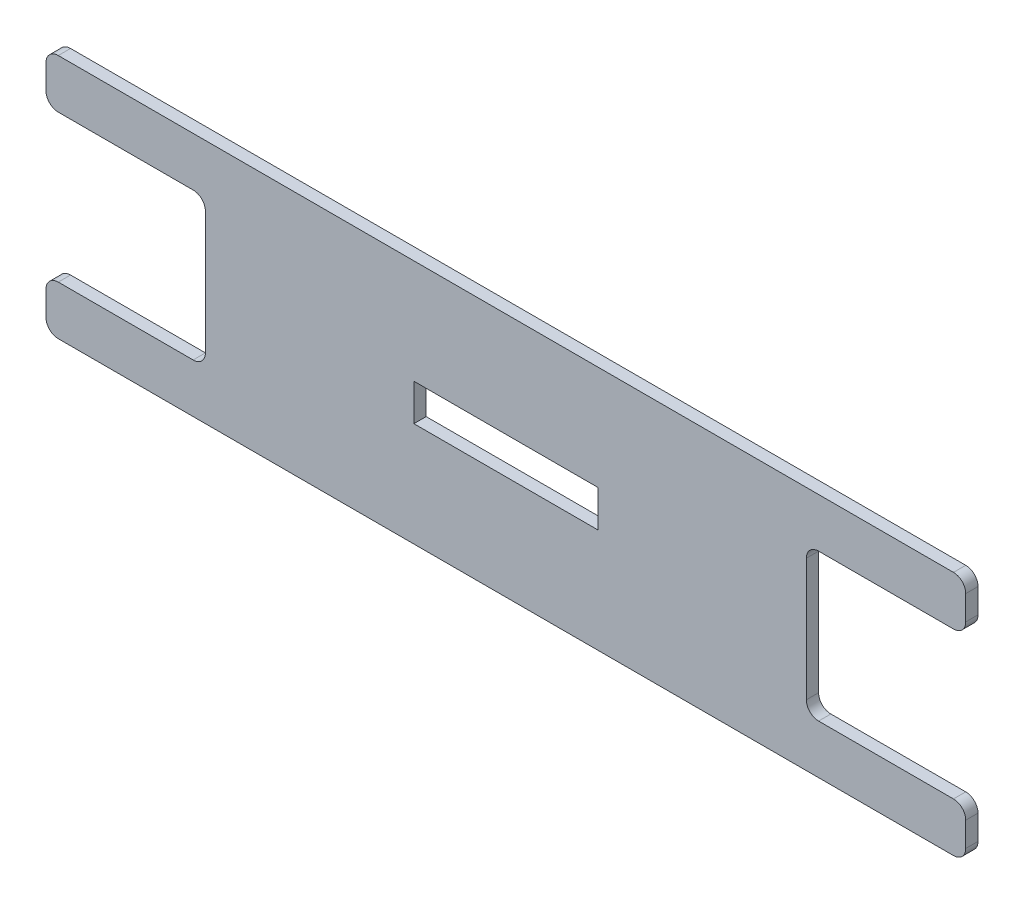
ISO-10303-21;
HEADER;
FILE_DESCRIPTION(('STEP AP214'),'2;1');
FILE_NAME('part.step','',(''),(''),'','','');
FILE_SCHEMA(('AUTOMOTIVE_DESIGN { 1 0 10303 214 1 1 1 1 }'));
ENDSEC;
DATA;
#1=APPLICATION_CONTEXT('core data for automotive mechanical design processes');
#2=APPLICATION_PROTOCOL_DEFINITION('international standard','automotive_design',2000,#1);
#3=PRODUCT_CONTEXT('',#1,'mechanical');
#4=PRODUCT('Part','Part','',(#3));
#5=PRODUCT_RELATED_PRODUCT_CATEGORY('part','',(#4));
#6=PRODUCT_DEFINITION_FORMATION('','',#4);
#7=PRODUCT_DEFINITION_CONTEXT('part definition',#1,'design');
#8=PRODUCT_DEFINITION('design','',#6,#7);
#9=PRODUCT_DEFINITION_SHAPE('','',#8);
#10=(LENGTH_UNIT() NAMED_UNIT(*) SI_UNIT(.MILLI.,.METRE.));
#11=(NAMED_UNIT(*) PLANE_ANGLE_UNIT() SI_UNIT($,.RADIAN.));
#12=(NAMED_UNIT(*) SI_UNIT($,.STERADIAN.) SOLID_ANGLE_UNIT());
#13=UNCERTAINTY_MEASURE_WITH_UNIT(LENGTH_MEASURE(1.E-05),#10,'distance_accuracy_value','');
#14=(GEOMETRIC_REPRESENTATION_CONTEXT(3) GLOBAL_UNCERTAINTY_ASSIGNED_CONTEXT((#13)) GLOBAL_UNIT_ASSIGNED_CONTEXT((#10,
#11,#12)) REPRESENTATION_CONTEXT('',''));
#15=CARTESIAN_POINT('',(0.,0.,0.));
#16=DIRECTION('',(0.,0.,1.));
#17=DIRECTION('',(1.,0.,0.));
#18=AXIS2_PLACEMENT_3D('',#15,#16,#17);
#19=CARTESIAN_POINT('',(37.5,-9.99999999999999,1.));
#20=DIRECTION('',(-1.,0.,0.));
#21=DIRECTION('',(0.,0.,1.));
#22=AXIS2_PLACEMENT_3D('',#19,#20,#21);
#23=PLANE('',#22);
#24=DIRECTION('',(0.,1.,0.));
#25=VECTOR('',#24,1.);
#26=CARTESIAN_POINT('',(37.5,-9.99999999999999,1.));
#27=LINE('',#26,#25);
#28=CARTESIAN_POINT('',(37.5,-8.99999999999999,1.));
#29=VERTEX_POINT('',#28);
#30=CARTESIAN_POINT('',(37.5,-7.00000000000001,1.));
#31=VERTEX_POINT('',#30);
#32=EDGE_CURVE('E292',#29,#31,#27,.T.);
#33=ORIENTED_EDGE('',*,*,#32,.F.);
#34=DIRECTION('',(0.,0.,-1.));
#35=VECTOR('',#34,1.);
#36=CARTESIAN_POINT('',(37.5,-8.99999999999999,1.));
#37=LINE('',#36,#35);
#38=CARTESIAN_POINT('',(37.5,-8.99999999999999,0.));
#39=VERTEX_POINT('',#38);
#40=EDGE_CURVE('E366',#29,#39,#37,.T.);
#41=ORIENTED_EDGE('',*,*,#40,.T.);
#42=DIRECTION('',(0.,1.,0.));
#43=VECTOR('',#42,1.);
#44=CARTESIAN_POINT('',(37.5,-9.99999999999999,0.));
#45=LINE('',#44,#43);
#46=CARTESIAN_POINT('',(37.5,-7.00000000000001,0.));
#47=VERTEX_POINT('',#46);
#48=EDGE_CURVE('E305',#39,#47,#45,.T.);
#49=ORIENTED_EDGE('',*,*,#48,.T.);
#50=DIRECTION('',(0.,0.,1.));
#51=VECTOR('',#50,1.);
#52=CARTESIAN_POINT('',(37.5,-7.00000000000001,1.));
#53=LINE('',#52,#51);
#54=EDGE_CURVE('E363',#47,#31,#53,.T.);
#55=ORIENTED_EDGE('',*,*,#54,.T.);
#56=EDGE_LOOP('',(#33,#41,#49,#55));
#57=FACE_BOUND('',#56,.T.);
#58=ADVANCED_FACE('F32',(#57),#23,.F.);
#59=CARTESIAN_POINT('',(37.5,7.,1.));
#60=VERTEX_POINT('',#59);
#61=CARTESIAN_POINT('',(37.5,9.00000000000001,1.));
#62=VERTEX_POINT('',#61);
#63=EDGE_CURVE('E289',#60,#62,#27,.T.);
#64=ORIENTED_EDGE('',*,*,#63,.F.);
#65=DIRECTION('',(0.,0.,1.));
#66=VECTOR('',#65,1.);
#67=CARTESIAN_POINT('',(37.5,7.,0.));
#68=LINE('',#67,#66);
#69=CARTESIAN_POINT('',(37.5,7.,0.));
#70=VERTEX_POINT('',#69);
#71=EDGE_CURVE('E404',#60,#70,#68,.F.);
#72=ORIENTED_EDGE('',*,*,#71,.T.);
#73=CARTESIAN_POINT('',(37.5,9.00000000000001,0.));
#74=VERTEX_POINT('',#73);
#75=EDGE_CURVE('E302',#70,#74,#45,.T.);
#76=ORIENTED_EDGE('',*,*,#75,.T.);
#77=DIRECTION('',(0.,0.,-1.));
#78=VECTOR('',#77,1.);
#79=CARTESIAN_POINT('',(37.5,9.00000000000001,1.));
#80=LINE('',#79,#78);
#81=EDGE_CURVE('E402',#74,#62,#80,.F.);
#82=ORIENTED_EDGE('',*,*,#81,.T.);
#83=EDGE_LOOP('',(#64,#72,#76,#82));
#84=FACE_BOUND('',#83,.T.);
#85=ADVANCED_FACE('F439',(#84),#23,.F.);
#86=CARTESIAN_POINT('',(0.,0.,1.));
#87=DIRECTION('',(0.,0.,1.));
#88=DIRECTION('',(1.,0.,0.));
#89=AXIS2_PLACEMENT_3D('',#86,#87,#88);
#90=PLANE('',#89);
#91=DIRECTION('',(0.,-1.,0.));
#92=VECTOR('',#91,1.);
#93=CARTESIAN_POINT('',(-7.5,-1.5,1.));
#94=LINE('',#93,#92);
#95=CARTESIAN_POINT('',(-7.5,1.5,1.));
#96=VERTEX_POINT('',#95);
#97=CARTESIAN_POINT('',(-7.5,-1.5,1.));
#98=VERTEX_POINT('',#97);
#99=EDGE_CURVE('E47',#96,#98,#94,.T.);
#100=ORIENTED_EDGE('',*,*,#99,.F.);
#101=DIRECTION('',(-1.,0.,0.));
#102=VECTOR('',#101,1.);
#103=CARTESIAN_POINT('',(7.5,1.5,1.));
#104=LINE('',#103,#102);
#105=CARTESIAN_POINT('',(7.5,1.5,1.));
#106=VERTEX_POINT('',#105);
#107=EDGE_CURVE('E236',#106,#96,#104,.T.);
#108=ORIENTED_EDGE('',*,*,#107,.F.);
#109=DIRECTION('',(0.,1.,0.));
#110=VECTOR('',#109,1.);
#111=CARTESIAN_POINT('',(7.5,-1.5,1.));
#112=LINE('',#111,#110);
#113=CARTESIAN_POINT('',(7.5,-1.5,1.));
#114=VERTEX_POINT('',#113);
#115=EDGE_CURVE('E220',#114,#106,#112,.T.);
#116=ORIENTED_EDGE('',*,*,#115,.F.);
#117=DIRECTION('',(1.,0.,0.));
#118=VECTOR('',#117,1.);
#119=CARTESIAN_POINT('',(7.5,-1.5,1.));
#120=LINE('',#119,#118);
#121=EDGE_CURVE('E229',#98,#114,#120,.T.);
#122=ORIENTED_EDGE('',*,*,#121,.F.);
#123=EDGE_LOOP('',(#100,#108,#116,#122));
#124=FACE_BOUND('',#123,.T.);
#125=DIRECTION('',(1.,0.,0.));
#126=VECTOR('',#125,1.);
#127=CARTESIAN_POINT('',(37.5,-9.99999999999999,1.));
#128=LINE('',#127,#126);
#129=CARTESIAN_POINT('',(-36.5,-10.,1.));
#130=VERTEX_POINT('',#129);
#131=CARTESIAN_POINT('',(36.5,-9.99999999999999,1.));
#132=VERTEX_POINT('',#131);
#133=EDGE_CURVE('E285',#130,#132,#128,.T.);
#134=ORIENTED_EDGE('',*,*,#133,.T.);
#135=CARTESIAN_POINT('',(36.5,-8.99999999999999,1.));
#136=DIRECTION('',(0.,0.,1.));
#137=DIRECTION('',(1.,0.,0.));
#138=AXIS2_PLACEMENT_3D('',#135,#136,#137);
#139=CIRCLE('',#138,1.);
#140=EDGE_CURVE('E385',#132,#29,#139,.T.);
#141=ORIENTED_EDGE('',*,*,#140,.T.);
#142=ORIENTED_EDGE('',*,*,#32,.T.);
#143=CARTESIAN_POINT('',(36.5,-7.00000000000001,1.));
#144=DIRECTION('',(0.,0.,1.));
#145=DIRECTION('',(1.,0.,0.));
#146=AXIS2_PLACEMENT_3D('',#143,#144,#145);
#147=CIRCLE('',#146,1.);
#148=CARTESIAN_POINT('',(36.5,-6.00000000000001,1.));
#149=VERTEX_POINT('',#148);
#150=EDGE_CURVE('E383',#31,#149,#147,.T.);
#151=ORIENTED_EDGE('',*,*,#150,.T.);
#152=DIRECTION('',(-1.,0.,0.));
#153=VECTOR('',#152,1.);
#154=CARTESIAN_POINT('',(24.5,-6.,1.));
#155=LINE('',#154,#153);
#156=CARTESIAN_POINT('',(25.5,-6.,1.));
#157=VERTEX_POINT('',#156);
#158=EDGE_CURVE('E250',#149,#157,#155,.T.);
#159=ORIENTED_EDGE('',*,*,#158,.T.);
#160=CARTESIAN_POINT('',(25.5,-5.,1.));
#161=DIRECTION('',(0.,0.,1.));
#162=DIRECTION('',(1.,0.,0.));
#163=AXIS2_PLACEMENT_3D('',#160,#161,#162);
#164=CIRCLE('',#163,1.);
#165=CARTESIAN_POINT('',(24.5,-5.,1.));
#166=VERTEX_POINT('',#165);
#167=EDGE_CURVE('E409',#157,#166,#164,.F.);
#168=ORIENTED_EDGE('',*,*,#167,.T.);
#169=DIRECTION('',(0.,1.,0.));
#170=VECTOR('',#169,1.);
#171=CARTESIAN_POINT('',(24.5,6.,1.));
#172=LINE('',#171,#170);
#173=CARTESIAN_POINT('',(24.5,5.,1.));
#174=VERTEX_POINT('',#173);
#175=EDGE_CURVE('E259',#166,#174,#172,.T.);
#176=ORIENTED_EDGE('',*,*,#175,.T.);
#177=CARTESIAN_POINT('',(25.5,5.,1.));
#178=DIRECTION('',(0.,0.,1.));
#179=DIRECTION('',(1.,0.,0.));
#180=AXIS2_PLACEMENT_3D('',#177,#178,#179);
#181=CIRCLE('',#180,1.);
#182=CARTESIAN_POINT('',(25.5,6.,1.));
#183=VERTEX_POINT('',#182);
#184=EDGE_CURVE('E413',#174,#183,#181,.F.);
#185=ORIENTED_EDGE('',*,*,#184,.T.);
#186=DIRECTION('',(1.,0.,0.));
#187=VECTOR('',#186,1.);
#188=CARTESIAN_POINT('',(37.5,6.,1.));
#189=LINE('',#188,#187);
#190=CARTESIAN_POINT('',(36.5,6.,1.));
#191=VERTEX_POINT('',#190);
#192=EDGE_CURVE('E243',#183,#191,#189,.T.);
#193=ORIENTED_EDGE('',*,*,#192,.T.);
#194=CARTESIAN_POINT('',(36.5,7.,1.));
#195=DIRECTION('',(0.,0.,1.));
#196=DIRECTION('',(1.,0.,0.));
#197=AXIS2_PLACEMENT_3D('',#194,#195,#196);
#198=CIRCLE('',#197,1.);
#199=EDGE_CURVE('E381',#191,#60,#198,.T.);
#200=ORIENTED_EDGE('',*,*,#199,.T.);
#201=ORIENTED_EDGE('',*,*,#63,.T.);
#202=CARTESIAN_POINT('',(36.5,9.00000000000001,1.));
#203=DIRECTION('',(0.,0.,1.));
#204=DIRECTION('',(1.,0.,0.));
#205=AXIS2_PLACEMENT_3D('',#202,#203,#204);
#206=CIRCLE('',#205,1.);
#207=CARTESIAN_POINT('',(36.5,10.,1.));
#208=VERTEX_POINT('',#207);
#209=EDGE_CURVE('E379',#62,#208,#206,.T.);
#210=ORIENTED_EDGE('',*,*,#209,.T.);
#211=DIRECTION('',(-1.,0.,0.));
#212=VECTOR('',#211,1.);
#213=CARTESIAN_POINT('',(37.5,10.,1.));
#214=LINE('',#213,#212);
#215=CARTESIAN_POINT('',(-36.5,9.99999999999999,1.));
#216=VERTEX_POINT('',#215);
#217=EDGE_CURVE('E293',#208,#216,#214,.T.);
#218=ORIENTED_EDGE('',*,*,#217,.T.);
#219=CARTESIAN_POINT('',(-36.5,9.,1.));
#220=DIRECTION('',(0.,0.,1.));
#221=DIRECTION('',(1.,0.,0.));
#222=AXIS2_PLACEMENT_3D('',#219,#220,#221);
#223=CIRCLE('',#222,1.);
#224=CARTESIAN_POINT('',(-37.5,9.,1.));
#225=VERTEX_POINT('',#224);
#226=EDGE_CURVE('E340',#216,#225,#223,.T.);
#227=ORIENTED_EDGE('',*,*,#226,.T.);
#228=DIRECTION('',(0.,-1.,0.));
#229=VECTOR('',#228,1.);
#230=CARTESIAN_POINT('',(-37.5,-10.,1.));
#231=LINE('',#230,#229);
#232=CARTESIAN_POINT('',(-37.5,7.,1.));
#233=VERTEX_POINT('',#232);
#234=EDGE_CURVE('E282',#225,#233,#231,.T.);
#235=ORIENTED_EDGE('',*,*,#234,.T.);
#236=CARTESIAN_POINT('',(-36.5,7.,1.));
#237=DIRECTION('',(0.,0.,1.));
#238=DIRECTION('',(1.,0.,0.));
#239=AXIS2_PLACEMENT_3D('',#236,#237,#238);
#240=CIRCLE('',#239,1.);
#241=CARTESIAN_POINT('',(-36.5,6.,1.));
#242=VERTEX_POINT('',#241);
#243=EDGE_CURVE('E338',#233,#242,#240,.T.);
#244=ORIENTED_EDGE('',*,*,#243,.T.);
#245=DIRECTION('',(-1.,0.,0.));
#246=VECTOR('',#245,1.);
#247=CARTESIAN_POINT('',(-37.5,6.,1.));
#248=LINE('',#247,#246);
#249=CARTESIAN_POINT('',(-25.5,6.,1.));
#250=VERTEX_POINT('',#249);
#251=EDGE_CURVE('E268',#250,#242,#248,.T.);
#252=ORIENTED_EDGE('',*,*,#251,.F.);
#253=CARTESIAN_POINT('',(-25.5,5.,1.));
#254=DIRECTION('',(0.,0.,1.));
#255=DIRECTION('',(1.,0.,0.));
#256=AXIS2_PLACEMENT_3D('',#253,#254,#255);
#257=CIRCLE('',#256,1.);
#258=CARTESIAN_POINT('',(-24.5,5.,1.));
#259=VERTEX_POINT('',#258);
#260=EDGE_CURVE('E359',#250,#259,#257,.F.);
#261=ORIENTED_EDGE('',*,*,#260,.T.);
#262=DIRECTION('',(0.,1.,0.));
#263=VECTOR('',#262,1.);
#264=CARTESIAN_POINT('',(-24.5,6.,1.));
#265=LINE('',#264,#263);
#266=CARTESIAN_POINT('',(-24.5,-5.,1.));
#267=VERTEX_POINT('',#266);
#268=EDGE_CURVE('E277',#267,#259,#265,.T.);
#269=ORIENTED_EDGE('',*,*,#268,.F.);
#270=CARTESIAN_POINT('',(-25.5,-5.,1.));
#271=DIRECTION('',(0.,0.,1.));
#272=DIRECTION('',(1.,0.,0.));
#273=AXIS2_PLACEMENT_3D('',#270,#271,#272);
#274=CIRCLE('',#273,1.);
#275=CARTESIAN_POINT('',(-25.5,-6.,1.));
#276=VERTEX_POINT('',#275);
#277=EDGE_CURVE('E355',#267,#276,#274,.F.);
#278=ORIENTED_EDGE('',*,*,#277,.T.);
#279=DIRECTION('',(1.,0.,0.));
#280=VECTOR('',#279,1.);
#281=CARTESIAN_POINT('',(-24.5,-6.,1.));
#282=LINE('',#281,#280);
#283=CARTESIAN_POINT('',(-36.5,-6.00000000000001,1.));
#284=VERTEX_POINT('',#283);
#285=EDGE_CURVE('E256',#284,#276,#282,.T.);
#286=ORIENTED_EDGE('',*,*,#285,.F.);
#287=CARTESIAN_POINT('',(-36.5,-7.00000000000001,1.));
#288=DIRECTION('',(0.,0.,1.));
#289=DIRECTION('',(1.,0.,0.));
#290=AXIS2_PLACEMENT_3D('',#287,#288,#289);
#291=CIRCLE('',#290,1.);
#292=CARTESIAN_POINT('',(-37.5,-7.00000000000001,1.));
#293=VERTEX_POINT('',#292);
#294=EDGE_CURVE('E342',#284,#293,#291,.T.);
#295=ORIENTED_EDGE('',*,*,#294,.T.);
#296=CARTESIAN_POINT('',(-37.5,-9.00000000000001,1.));
#297=VERTEX_POINT('',#296);
#298=EDGE_CURVE('E286',#293,#297,#231,.T.);
#299=ORIENTED_EDGE('',*,*,#298,.T.);
#300=CARTESIAN_POINT('',(-36.5,-9.00000000000001,1.));
#301=DIRECTION('',(0.,0.,1.));
#302=DIRECTION('',(1.,0.,0.));
#303=AXIS2_PLACEMENT_3D('',#300,#301,#302);
#304=CIRCLE('',#303,1.);
#305=EDGE_CURVE('E344',#297,#130,#304,.T.);
#306=ORIENTED_EDGE('',*,*,#305,.T.);
#307=EDGE_LOOP('',(#134,#141,#142,#151,#159,#168,#176,#185,#193,#200,#201,#210,#218,#227,#235,
#244,#252,#261,#269,#278,#286,#295,#299,#306));
#308=FACE_BOUND('',#307,.T.);
#309=ADVANCED_FACE('F233',(#124,#308),#90,.T.);
#310=CARTESIAN_POINT('',(0.,0.,0.));
#311=DIRECTION('',(0.,0.,1.));
#312=DIRECTION('',(1.,0.,0.));
#313=AXIS2_PLACEMENT_3D('',#310,#311,#312);
#314=PLANE('',#313);
#315=DIRECTION('',(-1.,0.,0.));
#316=VECTOR('',#315,1.);
#317=CARTESIAN_POINT('',(0.,1.5,0.));
#318=LINE('',#317,#316);
#319=CARTESIAN_POINT('',(7.5,1.5,0.));
#320=VERTEX_POINT('',#319);
#321=CARTESIAN_POINT('',(-7.5,1.5,0.));
#322=VERTEX_POINT('',#321);
#323=EDGE_CURVE('E40',#320,#322,#318,.T.);
#324=ORIENTED_EDGE('',*,*,#323,.T.);
#325=DIRECTION('',(0.,-1.,0.));
#326=VECTOR('',#325,1.);
#327=CARTESIAN_POINT('',(-7.5,0.,0.));
#328=LINE('',#327,#326);
#329=CARTESIAN_POINT('',(-7.5,-1.5,0.));
#330=VERTEX_POINT('',#329);
#331=EDGE_CURVE('E11',#322,#330,#328,.T.);
#332=ORIENTED_EDGE('',*,*,#331,.T.);
#333=DIRECTION('',(1.,0.,0.));
#334=VECTOR('',#333,1.);
#335=CARTESIAN_POINT('',(0.,-1.5,0.));
#336=LINE('',#335,#334);
#337=CARTESIAN_POINT('',(7.5,-1.5,0.));
#338=VERTEX_POINT('',#337);
#339=EDGE_CURVE('E417',#330,#338,#336,.T.);
#340=ORIENTED_EDGE('',*,*,#339,.T.);
#341=DIRECTION('',(0.,1.,0.));
#342=VECTOR('',#341,1.);
#343=CARTESIAN_POINT('',(7.5,0.,0.));
#344=LINE('',#343,#342);
#345=EDGE_CURVE('E223',#338,#320,#344,.T.);
#346=ORIENTED_EDGE('',*,*,#345,.T.);
#347=EDGE_LOOP('',(#324,#332,#340,#346));
#348=FACE_BOUND('',#347,.T.);
#349=ORIENTED_EDGE('',*,*,#48,.F.);
#350=CARTESIAN_POINT('',(36.5,-8.99999999999999,0.));
#351=DIRECTION('',(0.,0.,1.));
#352=DIRECTION('',(1.,0.,0.));
#353=AXIS2_PLACEMENT_3D('',#350,#351,#352);
#354=CIRCLE('',#353,1.);
#355=CARTESIAN_POINT('',(36.5,-9.99999999999999,0.));
#356=VERTEX_POINT('',#355);
#357=EDGE_CURVE('E375',#39,#356,#354,.F.);
#358=ORIENTED_EDGE('',*,*,#357,.T.);
#359=DIRECTION('',(1.,0.,0.));
#360=VECTOR('',#359,1.);
#361=CARTESIAN_POINT('',(37.5,-9.99999999999999,0.));
#362=LINE('',#361,#360);
#363=CARTESIAN_POINT('',(-36.5,-10.,0.));
#364=VERTEX_POINT('',#363);
#365=EDGE_CURVE('E299',#364,#356,#362,.T.);
#366=ORIENTED_EDGE('',*,*,#365,.F.);
#367=CARTESIAN_POINT('',(-36.5,-9.00000000000001,0.));
#368=DIRECTION('',(0.,0.,1.));
#369=DIRECTION('',(1.,0.,0.));
#370=AXIS2_PLACEMENT_3D('',#367,#368,#369);
#371=CIRCLE('',#370,1.);
#372=CARTESIAN_POINT('',(-37.5,-9.00000000000001,0.));
#373=VERTEX_POINT('',#372);
#374=EDGE_CURVE('E332',#364,#373,#371,.F.);
#375=ORIENTED_EDGE('',*,*,#374,.T.);
#376=DIRECTION('',(0.,-1.,0.));
#377=VECTOR('',#376,1.);
#378=CARTESIAN_POINT('',(-37.5,-10.,0.));
#379=LINE('',#378,#377);
#380=CARTESIAN_POINT('',(-37.5,-7.00000000000001,0.));
#381=VERTEX_POINT('',#380);
#382=EDGE_CURVE('E274',#381,#373,#379,.T.);
#383=ORIENTED_EDGE('',*,*,#382,.F.);
#384=CARTESIAN_POINT('',(-36.5,-7.00000000000001,0.));
#385=DIRECTION('',(0.,0.,1.));
#386=DIRECTION('',(1.,0.,0.));
#387=AXIS2_PLACEMENT_3D('',#384,#385,#386);
#388=CIRCLE('',#387,1.);
#389=CARTESIAN_POINT('',(-36.5,-6.00000000000001,0.));
#390=VERTEX_POINT('',#389);
#391=EDGE_CURVE('E330',#381,#390,#388,.F.);
#392=ORIENTED_EDGE('',*,*,#391,.T.);
#393=DIRECTION('',(1.,0.,0.));
#394=VECTOR('',#393,1.);
#395=CARTESIAN_POINT('',(-24.5,-6.,0.));
#396=LINE('',#395,#394);
#397=CARTESIAN_POINT('',(-25.5,-6.,0.));
#398=VERTEX_POINT('',#397);
#399=EDGE_CURVE('E264',#390,#398,#396,.T.);
#400=ORIENTED_EDGE('',*,*,#399,.T.);
#401=CARTESIAN_POINT('',(-25.5,-5.,0.));
#402=DIRECTION('',(0.,0.,1.));
#403=DIRECTION('',(1.,0.,0.));
#404=AXIS2_PLACEMENT_3D('',#401,#402,#403);
#405=CIRCLE('',#404,1.);
#406=CARTESIAN_POINT('',(-24.5,-5.,0.));
#407=VERTEX_POINT('',#406);
#408=EDGE_CURVE('E357',#398,#407,#405,.T.);
#409=ORIENTED_EDGE('',*,*,#408,.T.);
#410=DIRECTION('',(0.,1.,0.));
#411=VECTOR('',#410,1.);
#412=CARTESIAN_POINT('',(-24.5,6.,0.));
#413=LINE('',#412,#411);
#414=CARTESIAN_POINT('',(-24.5,5.,0.));
#415=VERTEX_POINT('',#414);
#416=EDGE_CURVE('E267',#407,#415,#413,.T.);
#417=ORIENTED_EDGE('',*,*,#416,.T.);
#418=CARTESIAN_POINT('',(-25.5,5.,0.));
#419=DIRECTION('',(0.,0.,1.));
#420=DIRECTION('',(1.,0.,0.));
#421=AXIS2_PLACEMENT_3D('',#418,#419,#420);
#422=CIRCLE('',#421,1.);
#423=CARTESIAN_POINT('',(-25.5,6.,0.));
#424=VERTEX_POINT('',#423);
#425=EDGE_CURVE('E361',#415,#424,#422,.T.);
#426=ORIENTED_EDGE('',*,*,#425,.T.);
#427=DIRECTION('',(-1.,0.,0.));
#428=VECTOR('',#427,1.);
#429=CARTESIAN_POINT('',(-37.5,6.,0.));
#430=LINE('',#429,#428);
#431=CARTESIAN_POINT('',(-36.5,6.,0.));
#432=VERTEX_POINT('',#431);
#433=EDGE_CURVE('E271',#424,#432,#430,.T.);
#434=ORIENTED_EDGE('',*,*,#433,.T.);
#435=CARTESIAN_POINT('',(-36.5,7.,0.));
#436=DIRECTION('',(0.,0.,1.));
#437=DIRECTION('',(1.,0.,0.));
#438=AXIS2_PLACEMENT_3D('',#435,#436,#437);
#439=CIRCLE('',#438,1.);
#440=CARTESIAN_POINT('',(-37.5,7.,0.));
#441=VERTEX_POINT('',#440);
#442=EDGE_CURVE('E325',#432,#441,#439,.F.);
#443=ORIENTED_EDGE('',*,*,#442,.T.);
#444=CARTESIAN_POINT('',(-37.5,9.,0.));
#445=VERTEX_POINT('',#444);
#446=EDGE_CURVE('E298',#445,#441,#379,.T.);
#447=ORIENTED_EDGE('',*,*,#446,.F.);
#448=CARTESIAN_POINT('',(-36.5,9.,0.));
#449=DIRECTION('',(0.,0.,1.));
#450=DIRECTION('',(1.,0.,0.));
#451=AXIS2_PLACEMENT_3D('',#448,#449,#450);
#452=CIRCLE('',#451,1.);
#453=CARTESIAN_POINT('',(-36.5,9.99999999999999,0.));
#454=VERTEX_POINT('',#453);
#455=EDGE_CURVE('E327',#445,#454,#452,.F.);
#456=ORIENTED_EDGE('',*,*,#455,.T.);
#457=DIRECTION('',(-1.,0.,0.));
#458=VECTOR('',#457,1.);
#459=CARTESIAN_POINT('',(37.5,10.,0.));
#460=LINE('',#459,#458);
#461=CARTESIAN_POINT('',(36.5,10.,0.));
#462=VERTEX_POINT('',#461);
#463=EDGE_CURVE('E306',#462,#454,#460,.T.);
#464=ORIENTED_EDGE('',*,*,#463,.F.);
#465=CARTESIAN_POINT('',(36.5,9.00000000000001,0.));
#466=DIRECTION('',(0.,0.,1.));
#467=DIRECTION('',(1.,0.,0.));
#468=AXIS2_PLACEMENT_3D('',#465,#466,#467);
#469=CIRCLE('',#468,1.);
#470=EDGE_CURVE('E369',#462,#74,#469,.F.);
#471=ORIENTED_EDGE('',*,*,#470,.T.);
#472=ORIENTED_EDGE('',*,*,#75,.F.);
#473=CARTESIAN_POINT('',(36.5,7.,0.));
#474=DIRECTION('',(0.,0.,1.));
#475=DIRECTION('',(1.,0.,0.));
#476=AXIS2_PLACEMENT_3D('',#473,#474,#475);
#477=CIRCLE('',#476,1.);
#478=CARTESIAN_POINT('',(36.5,6.,0.));
#479=VERTEX_POINT('',#478);
#480=EDGE_CURVE('E371',#70,#479,#477,.F.);
#481=ORIENTED_EDGE('',*,*,#480,.T.);
#482=DIRECTION('',(1.,0.,0.));
#483=VECTOR('',#482,1.);
#484=CARTESIAN_POINT('',(37.5,6.,0.));
#485=LINE('',#484,#483);
#486=CARTESIAN_POINT('',(25.5,6.,0.));
#487=VERTEX_POINT('',#486);
#488=EDGE_CURVE('E246',#487,#479,#485,.T.);
#489=ORIENTED_EDGE('',*,*,#488,.F.);
#490=CARTESIAN_POINT('',(25.5,5.,0.));
#491=DIRECTION('',(0.,0.,1.));
#492=DIRECTION('',(1.,0.,0.));
#493=AXIS2_PLACEMENT_3D('',#490,#491,#492);
#494=CIRCLE('',#493,1.);
#495=CARTESIAN_POINT('',(24.5,5.,0.));
#496=VERTEX_POINT('',#495);
#497=EDGE_CURVE('E415',#487,#496,#494,.T.);
#498=ORIENTED_EDGE('',*,*,#497,.T.);
#499=DIRECTION('',(0.,1.,0.));
#500=VECTOR('',#499,1.);
#501=CARTESIAN_POINT('',(24.5,6.,0.));
#502=LINE('',#501,#500);
#503=CARTESIAN_POINT('',(24.5,-5.,0.));
#504=VERTEX_POINT('',#503);
#505=EDGE_CURVE('E249',#504,#496,#502,.T.);
#506=ORIENTED_EDGE('',*,*,#505,.F.);
#507=CARTESIAN_POINT('',(25.5,-5.,0.));
#508=DIRECTION('',(0.,0.,1.));
#509=DIRECTION('',(1.,0.,0.));
#510=AXIS2_PLACEMENT_3D('',#507,#508,#509);
#511=CIRCLE('',#510,1.);
#512=CARTESIAN_POINT('',(25.5,-6.,0.));
#513=VERTEX_POINT('',#512);
#514=EDGE_CURVE('E411',#504,#513,#511,.T.);
#515=ORIENTED_EDGE('',*,*,#514,.T.);
#516=DIRECTION('',(-1.,0.,0.));
#517=VECTOR('',#516,1.);
#518=CARTESIAN_POINT('',(24.5,-6.,0.));
#519=LINE('',#518,#517);
#520=CARTESIAN_POINT('',(36.5,-6.00000000000001,0.));
#521=VERTEX_POINT('',#520);
#522=EDGE_CURVE('E253',#521,#513,#519,.T.);
#523=ORIENTED_EDGE('',*,*,#522,.F.);
#524=CARTESIAN_POINT('',(36.5,-7.00000000000001,0.));
#525=DIRECTION('',(0.,0.,1.));
#526=DIRECTION('',(1.,0.,0.));
#527=AXIS2_PLACEMENT_3D('',#524,#525,#526);
#528=CIRCLE('',#527,1.);
#529=EDGE_CURVE('E373',#521,#47,#528,.F.);
#530=ORIENTED_EDGE('',*,*,#529,.T.);
#531=EDGE_LOOP('',(#349,#358,#366,#375,#383,#392,#400,#409,#417,#426,#434,#443,#447,#456,#464,
#471,#472,#481,#489,#498,#506,#515,#523,#530));
#532=FACE_BOUND('',#531,.T.);
#533=ADVANCED_FACE('F421',(#348,#532),#314,.F.);
#534=CARTESIAN_POINT('',(-37.5,-10.,1.));
#535=DIRECTION('',(1.,0.,0.));
#536=DIRECTION('',(0.,0.,-1.));
#537=AXIS2_PLACEMENT_3D('',#534,#535,#536);
#538=PLANE('',#537);
#539=ORIENTED_EDGE('',*,*,#234,.F.);
#540=DIRECTION('',(0.,0.,-1.));
#541=VECTOR('',#540,1.);
#542=CARTESIAN_POINT('',(-37.5,9.,1.));
#543=LINE('',#542,#541);
#544=EDGE_CURVE('E349',#225,#445,#543,.T.);
#545=ORIENTED_EDGE('',*,*,#544,.T.);
#546=ORIENTED_EDGE('',*,*,#446,.T.);
#547=DIRECTION('',(0.,0.,1.));
#548=VECTOR('',#547,1.);
#549=CARTESIAN_POINT('',(-37.5,7.,1.));
#550=LINE('',#549,#548);
#551=EDGE_CURVE('E346',#441,#233,#550,.T.);
#552=ORIENTED_EDGE('',*,*,#551,.T.);
#553=EDGE_LOOP('',(#539,#545,#546,#552));
#554=FACE_BOUND('',#553,.T.);
#555=ADVANCED_FACE('F458',(#554),#538,.F.);
#556=ORIENTED_EDGE('',*,*,#382,.T.);
#557=DIRECTION('',(0.,0.,-1.));
#558=VECTOR('',#557,1.);
#559=CARTESIAN_POINT('',(-37.5,-9.00000000000001,1.));
#560=LINE('',#559,#558);
#561=EDGE_CURVE('E336',#373,#297,#560,.F.);
#562=ORIENTED_EDGE('',*,*,#561,.T.);
#563=ORIENTED_EDGE('',*,*,#298,.F.);
#564=DIRECTION('',(0.,0.,1.));
#565=VECTOR('',#564,1.);
#566=CARTESIAN_POINT('',(-37.5,-7.00000000000001,1.));
#567=LINE('',#566,#565);
#568=EDGE_CURVE('E334',#293,#381,#567,.F.);
#569=ORIENTED_EDGE('',*,*,#568,.T.);
#570=EDGE_LOOP('',(#556,#562,#563,#569));
#571=FACE_BOUND('',#570,.T.);
#572=ADVANCED_FACE('F454',(#571),#538,.F.);
#573=CARTESIAN_POINT('',(37.5,-9.99999999999999,1.));
#574=DIRECTION('',(0.,1.,0.));
#575=DIRECTION('',(-1.,0.,0.));
#576=AXIS2_PLACEMENT_3D('',#573,#574,#575);
#577=PLANE('',#576);
#578=ORIENTED_EDGE('',*,*,#365,.T.);
#579=DIRECTION('',(0.,0.,-1.));
#580=VECTOR('',#579,1.);
#581=CARTESIAN_POINT('',(36.5,-9.99999999999999,1.));
#582=LINE('',#581,#580);
#583=EDGE_CURVE('E377',#356,#132,#582,.F.);
#584=ORIENTED_EDGE('',*,*,#583,.T.);
#585=ORIENTED_EDGE('',*,*,#133,.F.);
#586=DIRECTION('',(0.,0.,-1.));
#587=VECTOR('',#586,1.);
#588=CARTESIAN_POINT('',(-36.5,-10.,1.));
#589=LINE('',#588,#587);
#590=EDGE_CURVE('E322',#130,#364,#589,.T.);
#591=ORIENTED_EDGE('',*,*,#590,.T.);
#592=EDGE_LOOP('',(#578,#584,#585,#591));
#593=FACE_BOUND('',#592,.T.);
#594=ADVANCED_FACE('F451',(#593),#577,.F.);
#595=CARTESIAN_POINT('',(37.5,10.,1.));
#596=DIRECTION('',(0.,-1.,0.));
#597=DIRECTION('',(1.,0.,0.));
#598=AXIS2_PLACEMENT_3D('',#595,#596,#597);
#599=PLANE('',#598);
#600=ORIENTED_EDGE('',*,*,#217,.F.);
#601=DIRECTION('',(0.,0.,-1.));
#602=VECTOR('',#601,1.);
#603=CARTESIAN_POINT('',(36.5,10.,1.));
#604=LINE('',#603,#602);
#605=EDGE_CURVE('E406',#208,#462,#604,.T.);
#606=ORIENTED_EDGE('',*,*,#605,.T.);
#607=ORIENTED_EDGE('',*,*,#463,.T.);
#608=DIRECTION('',(0.,0.,-1.));
#609=VECTOR('',#608,1.);
#610=CARTESIAN_POINT('',(-36.5,9.99999999999999,1.));
#611=LINE('',#610,#609);
#612=EDGE_CURVE('E352',#454,#216,#611,.F.);
#613=ORIENTED_EDGE('',*,*,#612,.T.);
#614=EDGE_LOOP('',(#600,#606,#607,#613));
#615=FACE_BOUND('',#614,.T.);
#616=ADVANCED_FACE('F449',(#615),#599,.F.);
#617=CARTESIAN_POINT('',(-37.5,6.,0.));
#618=DIRECTION('',(0.,1.,0.));
#619=DIRECTION('',(-1.,0.,0.));
#620=AXIS2_PLACEMENT_3D('',#617,#618,#619);
#621=PLANE('',#620);
#622=ORIENTED_EDGE('',*,*,#433,.F.);
#623=DIRECTION('',(0.,0.,1.));
#624=VECTOR('',#623,1.);
#625=CARTESIAN_POINT('',(-25.5,6.,1.));
#626=LINE('',#625,#624);
#627=EDGE_CURVE('E319',#424,#250,#626,.T.);
#628=ORIENTED_EDGE('',*,*,#627,.T.);
#629=ORIENTED_EDGE('',*,*,#251,.T.);
#630=DIRECTION('',(0.,0.,1.));
#631=VECTOR('',#630,1.);
#632=CARTESIAN_POINT('',(-36.5,6.,0.));
#633=LINE('',#632,#631);
#634=EDGE_CURVE('E317',#242,#432,#633,.F.);
#635=ORIENTED_EDGE('',*,*,#634,.T.);
#636=EDGE_LOOP('',(#622,#628,#629,#635));
#637=FACE_BOUND('',#636,.T.);
#638=ADVANCED_FACE('F562',(#637),#621,.F.);
#639=CARTESIAN_POINT('',(-24.5,6.,0.));
#640=DIRECTION('',(1.,0.,0.));
#641=DIRECTION('',(0.,0.,-1.));
#642=AXIS2_PLACEMENT_3D('',#639,#640,#641);
#643=PLANE('',#642);
#644=ORIENTED_EDGE('',*,*,#416,.F.);
#645=DIRECTION('',(0.,0.,1.));
#646=VECTOR('',#645,1.);
#647=CARTESIAN_POINT('',(-24.5,-5.,1.));
#648=LINE('',#647,#646);
#649=EDGE_CURVE('E309',#407,#267,#648,.T.);
#650=ORIENTED_EDGE('',*,*,#649,.T.);
#651=ORIENTED_EDGE('',*,*,#268,.T.);
#652=DIRECTION('',(0.,0.,1.));
#653=VECTOR('',#652,1.);
#654=CARTESIAN_POINT('',(-24.5,5.,0.));
#655=LINE('',#654,#653);
#656=EDGE_CURVE('E295',#259,#415,#655,.F.);
#657=ORIENTED_EDGE('',*,*,#656,.T.);
#658=EDGE_LOOP('',(#644,#650,#651,#657));
#659=FACE_BOUND('',#658,.T.);
#660=ADVANCED_FACE('F555',(#659),#643,.F.);
#661=CARTESIAN_POINT('',(-24.5,-6.,0.));
#662=DIRECTION('',(0.,-1.,0.));
#663=DIRECTION('',(1.,0.,0.));
#664=AXIS2_PLACEMENT_3D('',#661,#662,#663);
#665=PLANE('',#664);
#666=ORIENTED_EDGE('',*,*,#285,.T.);
#667=DIRECTION('',(0.,0.,1.));
#668=VECTOR('',#667,1.);
#669=CARTESIAN_POINT('',(-25.5,-6.,0.));
#670=LINE('',#669,#668);
#671=EDGE_CURVE('E315',#276,#398,#670,.F.);
#672=ORIENTED_EDGE('',*,*,#671,.T.);
#673=ORIENTED_EDGE('',*,*,#399,.F.);
#674=DIRECTION('',(0.,0.,1.));
#675=VECTOR('',#674,1.);
#676=CARTESIAN_POINT('',(-36.5,-6.00000000000001,0.));
#677=LINE('',#676,#675);
#678=EDGE_CURVE('E312',#390,#284,#677,.T.);
#679=ORIENTED_EDGE('',*,*,#678,.T.);
#680=EDGE_LOOP('',(#666,#672,#673,#679));
#681=FACE_BOUND('',#680,.T.);
#682=ADVANCED_FACE('F464',(#681),#665,.F.);
#683=CARTESIAN_POINT('',(-25.5,-5.,0.));
#684=DIRECTION('',(0.,0.,-1.));
#685=DIRECTION('',(-1.,0.,0.));
#686=AXIS2_PLACEMENT_3D('',#683,#684,#685);
#687=CYLINDRICAL_SURFACE('',#686,1.);
#688=ORIENTED_EDGE('',*,*,#408,.F.);
#689=ORIENTED_EDGE('',*,*,#671,.F.);
#690=ORIENTED_EDGE('',*,*,#277,.F.);
#691=ORIENTED_EDGE('',*,*,#649,.F.);
#692=EDGE_LOOP('',(#688,#689,#690,#691));
#693=FACE_BOUND('',#692,.T.);
#694=ADVANCED_FACE('F460',(#693),#687,.F.);
#695=CARTESIAN_POINT('',(-25.5,5.,0.));
#696=DIRECTION('',(0.,0.,-1.));
#697=DIRECTION('',(-1.,0.,0.));
#698=AXIS2_PLACEMENT_3D('',#695,#696,#697);
#699=CYLINDRICAL_SURFACE('',#698,1.);
#700=ORIENTED_EDGE('',*,*,#425,.F.);
#701=ORIENTED_EDGE('',*,*,#656,.F.);
#702=ORIENTED_EDGE('',*,*,#260,.F.);
#703=ORIENTED_EDGE('',*,*,#627,.F.);
#704=EDGE_LOOP('',(#700,#701,#702,#703));
#705=FACE_BOUND('',#704,.T.);
#706=ADVANCED_FACE('F463',(#705),#699,.F.);
#707=CARTESIAN_POINT('',(-36.5,-9.00000000000001,1.));
#708=DIRECTION('',(0.,0.,-1.));
#709=DIRECTION('',(-1.,0.,0.));
#710=AXIS2_PLACEMENT_3D('',#707,#708,#709);
#711=CYLINDRICAL_SURFACE('',#710,1.);
#712=ORIENTED_EDGE('',*,*,#305,.F.);
#713=ORIENTED_EDGE('',*,*,#561,.F.);
#714=ORIENTED_EDGE('',*,*,#374,.F.);
#715=ORIENTED_EDGE('',*,*,#590,.F.);
#716=EDGE_LOOP('',(#712,#713,#714,#715));
#717=FACE_BOUND('',#716,.T.);
#718=ADVANCED_FACE('F468',(#717),#711,.T.);
#719=CARTESIAN_POINT('',(-36.5,-7.00000000000001,0.));
#720=DIRECTION('',(0.,0.,1.));
#721=DIRECTION('',(1.,0.,0.));
#722=AXIS2_PLACEMENT_3D('',#719,#720,#721);
#723=CYLINDRICAL_SURFACE('',#722,1.);
#724=ORIENTED_EDGE('',*,*,#391,.F.);
#725=ORIENTED_EDGE('',*,*,#568,.F.);
#726=ORIENTED_EDGE('',*,*,#294,.F.);
#727=ORIENTED_EDGE('',*,*,#678,.F.);
#728=EDGE_LOOP('',(#724,#725,#726,#727));
#729=FACE_BOUND('',#728,.T.);
#730=ADVANCED_FACE('F472',(#729),#723,.T.);
#731=CARTESIAN_POINT('',(-36.5,9.,1.));
#732=DIRECTION('',(0.,0.,-1.));
#733=DIRECTION('',(-1.,0.,0.));
#734=AXIS2_PLACEMENT_3D('',#731,#732,#733);
#735=CYLINDRICAL_SURFACE('',#734,1.);
#736=ORIENTED_EDGE('',*,*,#226,.F.);
#737=ORIENTED_EDGE('',*,*,#612,.F.);
#738=ORIENTED_EDGE('',*,*,#455,.F.);
#739=ORIENTED_EDGE('',*,*,#544,.F.);
#740=EDGE_LOOP('',(#736,#737,#738,#739));
#741=FACE_BOUND('',#740,.T.);
#742=ADVANCED_FACE('F476',(#741),#735,.T.);
#743=CARTESIAN_POINT('',(-36.5,7.,1.));
#744=DIRECTION('',(0.,0.,1.));
#745=DIRECTION('',(1.,0.,0.));
#746=AXIS2_PLACEMENT_3D('',#743,#744,#745);
#747=CYLINDRICAL_SURFACE('',#746,1.);
#748=ORIENTED_EDGE('',*,*,#442,.F.);
#749=ORIENTED_EDGE('',*,*,#634,.F.);
#750=ORIENTED_EDGE('',*,*,#243,.F.);
#751=ORIENTED_EDGE('',*,*,#551,.F.);
#752=EDGE_LOOP('',(#748,#749,#750,#751));
#753=FACE_BOUND('',#752,.T.);
#754=ADVANCED_FACE('F480',(#753),#747,.T.);
#755=CARTESIAN_POINT('',(24.5,-6.,0.));
#756=DIRECTION('',(0.,1.,0.));
#757=DIRECTION('',(-1.,0.,0.));
#758=AXIS2_PLACEMENT_3D('',#755,#756,#757);
#759=PLANE('',#758);
#760=ORIENTED_EDGE('',*,*,#158,.F.);
#761=DIRECTION('',(0.,0.,1.));
#762=VECTOR('',#761,1.);
#763=CARTESIAN_POINT('',(36.5,-6.00000000000001,0.));
#764=LINE('',#763,#762);
#765=EDGE_CURVE('E390',#149,#521,#764,.F.);
#766=ORIENTED_EDGE('',*,*,#765,.T.);
#767=ORIENTED_EDGE('',*,*,#522,.T.);
#768=DIRECTION('',(0.,0.,1.));
#769=VECTOR('',#768,1.);
#770=CARTESIAN_POINT('',(25.5,-6.,1.));
#771=LINE('',#770,#769);
#772=EDGE_CURVE('E387',#513,#157,#771,.T.);
#773=ORIENTED_EDGE('',*,*,#772,.T.);
#774=EDGE_LOOP('',(#760,#766,#767,#773));
#775=FACE_BOUND('',#774,.T.);
#776=ADVANCED_FACE('F484',(#775),#759,.T.);
#777=CARTESIAN_POINT('',(24.5,6.,0.));
#778=DIRECTION('',(1.,0.,0.));
#779=DIRECTION('',(0.,0.,-1.));
#780=AXIS2_PLACEMENT_3D('',#777,#778,#779);
#781=PLANE('',#780);
#782=ORIENTED_EDGE('',*,*,#175,.F.);
#783=DIRECTION('',(0.,0.,1.));
#784=VECTOR('',#783,1.);
#785=CARTESIAN_POINT('',(24.5,-5.,0.));
#786=LINE('',#785,#784);
#787=EDGE_CURVE('E395',#166,#504,#786,.F.);
#788=ORIENTED_EDGE('',*,*,#787,.T.);
#789=ORIENTED_EDGE('',*,*,#505,.T.);
#790=DIRECTION('',(0.,0.,1.));
#791=VECTOR('',#790,1.);
#792=CARTESIAN_POINT('',(24.5,5.,1.));
#793=LINE('',#792,#791);
#794=EDGE_CURVE('E392',#496,#174,#793,.T.);
#795=ORIENTED_EDGE('',*,*,#794,.T.);
#796=EDGE_LOOP('',(#782,#788,#789,#795));
#797=FACE_BOUND('',#796,.T.);
#798=ADVANCED_FACE('F521',(#797),#781,.T.);
#799=CARTESIAN_POINT('',(37.5,6.,0.));
#800=DIRECTION('',(0.,-1.,0.));
#801=DIRECTION('',(1.,0.,0.));
#802=AXIS2_PLACEMENT_3D('',#799,#800,#801);
#803=PLANE('',#802);
#804=ORIENTED_EDGE('',*,*,#192,.F.);
#805=DIRECTION('',(0.,0.,1.));
#806=VECTOR('',#805,1.);
#807=CARTESIAN_POINT('',(25.5,6.,0.));
#808=LINE('',#807,#806);
#809=EDGE_CURVE('E400',#183,#487,#808,.F.);
#810=ORIENTED_EDGE('',*,*,#809,.T.);
#811=ORIENTED_EDGE('',*,*,#488,.T.);
#812=DIRECTION('',(0.,0.,1.));
#813=VECTOR('',#812,1.);
#814=CARTESIAN_POINT('',(36.5,6.,1.));
#815=LINE('',#814,#813);
#816=EDGE_CURVE('E397',#479,#191,#815,.T.);
#817=ORIENTED_EDGE('',*,*,#816,.T.);
#818=EDGE_LOOP('',(#804,#810,#811,#817));
#819=FACE_BOUND('',#818,.T.);
#820=ADVANCED_FACE('F490',(#819),#803,.T.);
#821=CARTESIAN_POINT('',(36.5,-8.99999999999999,1.));
#822=DIRECTION('',(0.,0.,-1.));
#823=DIRECTION('',(-1.,0.,0.));
#824=AXIS2_PLACEMENT_3D('',#821,#822,#823);
#825=CYLINDRICAL_SURFACE('',#824,1.);
#826=ORIENTED_EDGE('',*,*,#140,.F.);
#827=ORIENTED_EDGE('',*,*,#583,.F.);
#828=ORIENTED_EDGE('',*,*,#357,.F.);
#829=ORIENTED_EDGE('',*,*,#40,.F.);
#830=EDGE_LOOP('',(#826,#827,#828,#829));
#831=FACE_BOUND('',#830,.T.);
#832=ADVANCED_FACE('F486',(#831),#825,.T.);
#833=CARTESIAN_POINT('',(36.5,-7.00000000000001,1.));
#834=DIRECTION('',(0.,0.,-1.));
#835=DIRECTION('',(-1.,0.,0.));
#836=AXIS2_PLACEMENT_3D('',#833,#834,#835);
#837=CYLINDRICAL_SURFACE('',#836,1.);
#838=ORIENTED_EDGE('',*,*,#529,.F.);
#839=ORIENTED_EDGE('',*,*,#765,.F.);
#840=ORIENTED_EDGE('',*,*,#150,.F.);
#841=ORIENTED_EDGE('',*,*,#54,.F.);
#842=EDGE_LOOP('',(#838,#839,#840,#841));
#843=FACE_BOUND('',#842,.T.);
#844=ADVANCED_FACE('F489',(#843),#837,.T.);
#845=CARTESIAN_POINT('',(25.5,-5.,0.));
#846=DIRECTION('',(0.,0.,-1.));
#847=DIRECTION('',(-1.,0.,0.));
#848=AXIS2_PLACEMENT_3D('',#845,#846,#847);
#849=CYLINDRICAL_SURFACE('',#848,1.);
#850=ORIENTED_EDGE('',*,*,#514,.F.);
#851=ORIENTED_EDGE('',*,*,#787,.F.);
#852=ORIENTED_EDGE('',*,*,#167,.F.);
#853=ORIENTED_EDGE('',*,*,#772,.F.);
#854=EDGE_LOOP('',(#850,#851,#852,#853));
#855=FACE_BOUND('',#854,.T.);
#856=ADVANCED_FACE('F494',(#855),#849,.F.);
#857=CARTESIAN_POINT('',(25.5,5.,0.));
#858=DIRECTION('',(0.,0.,-1.));
#859=DIRECTION('',(-1.,0.,0.));
#860=AXIS2_PLACEMENT_3D('',#857,#858,#859);
#861=CYLINDRICAL_SURFACE('',#860,1.);
#862=ORIENTED_EDGE('',*,*,#497,.F.);
#863=ORIENTED_EDGE('',*,*,#809,.F.);
#864=ORIENTED_EDGE('',*,*,#184,.F.);
#865=ORIENTED_EDGE('',*,*,#794,.F.);
#866=EDGE_LOOP('',(#862,#863,#864,#865));
#867=FACE_BOUND('',#866,.T.);
#868=ADVANCED_FACE('F498',(#867),#861,.F.);
#869=CARTESIAN_POINT('',(36.5,7.,0.));
#870=DIRECTION('',(0.,0.,-1.));
#871=DIRECTION('',(-1.,0.,0.));
#872=AXIS2_PLACEMENT_3D('',#869,#870,#871);
#873=CYLINDRICAL_SURFACE('',#872,1.);
#874=ORIENTED_EDGE('',*,*,#480,.F.);
#875=ORIENTED_EDGE('',*,*,#71,.F.);
#876=ORIENTED_EDGE('',*,*,#199,.F.);
#877=ORIENTED_EDGE('',*,*,#816,.F.);
#878=EDGE_LOOP('',(#874,#875,#876,#877));
#879=FACE_BOUND('',#878,.T.);
#880=ADVANCED_FACE('F434',(#879),#873,.T.);
#881=CARTESIAN_POINT('',(36.5,9.00000000000001,1.));
#882=DIRECTION('',(0.,0.,-1.));
#883=DIRECTION('',(-1.,0.,0.));
#884=AXIS2_PLACEMENT_3D('',#881,#882,#883);
#885=CYLINDRICAL_SURFACE('',#884,1.);
#886=ORIENTED_EDGE('',*,*,#209,.F.);
#887=ORIENTED_EDGE('',*,*,#81,.F.);
#888=ORIENTED_EDGE('',*,*,#470,.F.);
#889=ORIENTED_EDGE('',*,*,#605,.F.);
#890=EDGE_LOOP('',(#886,#887,#888,#889));
#891=FACE_BOUND('',#890,.T.);
#892=ADVANCED_FACE('F34',(#891),#885,.T.);
#893=CARTESIAN_POINT('',(-7.5,-1.5,-0.25));
#894=DIRECTION('',(-1.,0.,0.));
#895=DIRECTION('',(0.,0.,1.));
#896=AXIS2_PLACEMENT_3D('',#893,#894,#895);
#897=PLANE('',#896);
#898=DIRECTION('',(0.,0.,1.));
#899=VECTOR('',#898,1.);
#900=CARTESIAN_POINT('',(-7.5,1.5,-0.25));
#901=LINE('',#900,#899);
#902=EDGE_CURVE('E241',#322,#96,#901,.T.);
#903=ORIENTED_EDGE('',*,*,#902,.T.);
#904=ORIENTED_EDGE('',*,*,#99,.T.);
#905=DIRECTION('',(0.,0.,1.));
#906=VECTOR('',#905,1.);
#907=CARTESIAN_POINT('',(-7.5,-1.5,-0.25));
#908=LINE('',#907,#906);
#909=EDGE_CURVE('E226',#330,#98,#908,.T.);
#910=ORIENTED_EDGE('',*,*,#909,.F.);
#911=ORIENTED_EDGE('',*,*,#331,.F.);
#912=EDGE_LOOP('',(#903,#904,#910,#911));
#913=FACE_BOUND('',#912,.T.);
#914=ADVANCED_FACE('F426',(#913),#897,.F.);
#915=CARTESIAN_POINT('',(7.5,1.5,-0.25));
#916=DIRECTION('',(0.,1.,0.));
#917=DIRECTION('',(-1.,0.,0.));
#918=AXIS2_PLACEMENT_3D('',#915,#916,#917);
#919=PLANE('',#918);
#920=DIRECTION('',(0.,0.,1.));
#921=VECTOR('',#920,1.);
#922=CARTESIAN_POINT('',(7.5,1.5,-0.25));
#923=LINE('',#922,#921);
#924=EDGE_CURVE('E225',#320,#106,#923,.T.);
#925=ORIENTED_EDGE('',*,*,#924,.T.);
#926=ORIENTED_EDGE('',*,*,#107,.T.);
#927=ORIENTED_EDGE('',*,*,#902,.F.);
#928=ORIENTED_EDGE('',*,*,#323,.F.);
#929=EDGE_LOOP('',(#925,#926,#927,#928));
#930=FACE_BOUND('',#929,.T.);
#931=ADVANCED_FACE('F425',(#930),#919,.F.);
#932=CARTESIAN_POINT('',(7.5,-1.5,-0.25));
#933=DIRECTION('',(1.,0.,0.));
#934=DIRECTION('',(0.,0.,-1.));
#935=AXIS2_PLACEMENT_3D('',#932,#933,#934);
#936=PLANE('',#935);
#937=DIRECTION('',(0.,0.,1.));
#938=VECTOR('',#937,1.);
#939=CARTESIAN_POINT('',(7.5,-1.5,-0.25));
#940=LINE('',#939,#938);
#941=EDGE_CURVE('E55',#338,#114,#940,.T.);
#942=ORIENTED_EDGE('',*,*,#941,.T.);
#943=ORIENTED_EDGE('',*,*,#115,.T.);
#944=ORIENTED_EDGE('',*,*,#924,.F.);
#945=ORIENTED_EDGE('',*,*,#345,.F.);
#946=EDGE_LOOP('',(#942,#943,#944,#945));
#947=FACE_BOUND('',#946,.T.);
#948=ADVANCED_FACE('F217',(#947),#936,.F.);
#949=CARTESIAN_POINT('',(7.5,-1.5,-0.25));
#950=DIRECTION('',(0.,-1.,0.));
#951=DIRECTION('',(1.,0.,0.));
#952=AXIS2_PLACEMENT_3D('',#949,#950,#951);
#953=PLANE('',#952);
#954=ORIENTED_EDGE('',*,*,#909,.T.);
#955=ORIENTED_EDGE('',*,*,#121,.T.);
#956=ORIENTED_EDGE('',*,*,#941,.F.);
#957=ORIENTED_EDGE('',*,*,#339,.F.);
#958=EDGE_LOOP('',(#954,#955,#956,#957));
#959=FACE_BOUND('',#958,.T.);
#960=ADVANCED_FACE('F230',(#959),#953,.F.);
#961=CLOSED_SHELL('',(#58,#85,#309,#533,#555,#572,#594,#616,#638,#660,#682,#694,#706,#718,#730,
#742,#754,#776,#798,#820,#832,#844,#856,#868,#880,#892,#914,#931,#948,#960));
#962=MANIFOLD_SOLID_BREP('B2',#961);
#963=ADVANCED_BREP_SHAPE_REPRESENTATION('',(#18,#962),#14);
#964=SHAPE_DEFINITION_REPRESENTATION(#9,#963);
ENDSEC;
END-ISO-10303-21;
